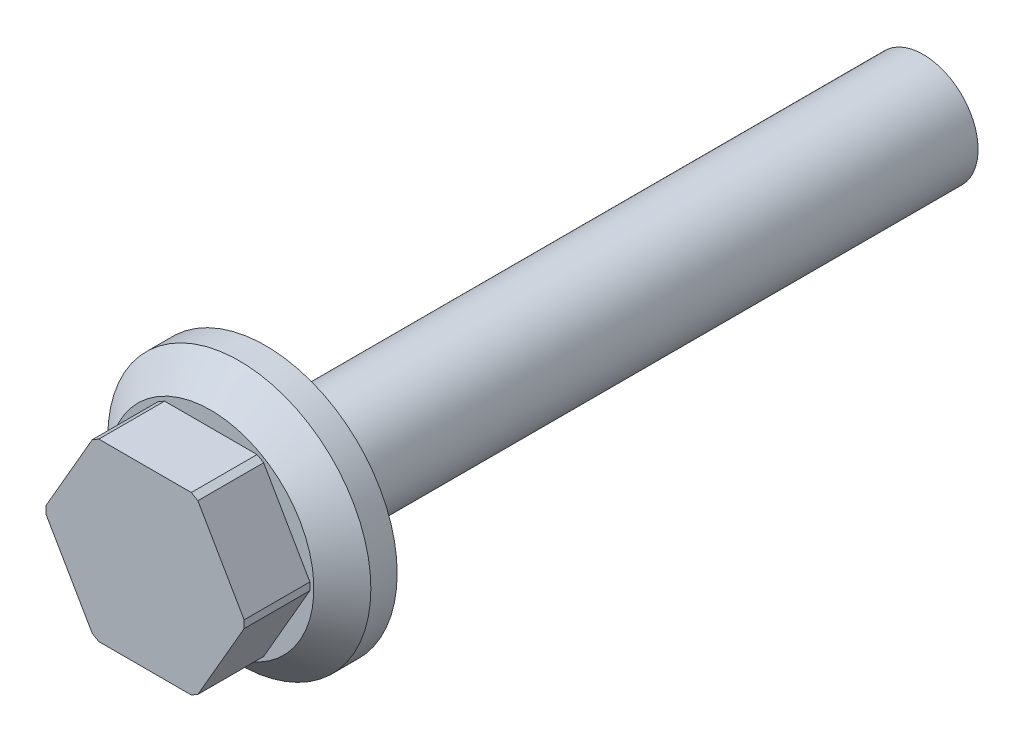
ISO-10303-21;
HEADER;
FILE_DESCRIPTION(('STEP AP214'),'2;1');
FILE_NAME('part.step','',(''),(''),'','','');
FILE_SCHEMA(('AUTOMOTIVE_DESIGN { 1 0 10303 214 1 1 1 1 }'));
ENDSEC;
DATA;
#1=APPLICATION_CONTEXT('core data for automotive mechanical design processes');
#2=APPLICATION_PROTOCOL_DEFINITION('international standard','automotive_design',2000,#1);
#3=PRODUCT_CONTEXT('',#1,'mechanical');
#4=PRODUCT('Part','Part','',(#3));
#5=PRODUCT_RELATED_PRODUCT_CATEGORY('part','',(#4));
#6=PRODUCT_DEFINITION_FORMATION('','',#4);
#7=PRODUCT_DEFINITION_CONTEXT('part definition',#1,'design');
#8=PRODUCT_DEFINITION('design','',#6,#7);
#9=PRODUCT_DEFINITION_SHAPE('','',#8);
#10=(LENGTH_UNIT() NAMED_UNIT(*) SI_UNIT(.MILLI.,.METRE.));
#11=(NAMED_UNIT(*) PLANE_ANGLE_UNIT() SI_UNIT($,.RADIAN.));
#12=(NAMED_UNIT(*) SI_UNIT($,.STERADIAN.) SOLID_ANGLE_UNIT());
#13=UNCERTAINTY_MEASURE_WITH_UNIT(LENGTH_MEASURE(1.E-05),#10,'distance_accuracy_value','');
#14=(GEOMETRIC_REPRESENTATION_CONTEXT(3) GLOBAL_UNCERTAINTY_ASSIGNED_CONTEXT((#13)) GLOBAL_UNIT_ASSIGNED_CONTEXT((#10,
#11,#12)) REPRESENTATION_CONTEXT('',''));
#15=CARTESIAN_POINT('',(0.,0.,0.));
#16=DIRECTION('',(0.,0.,1.));
#17=DIRECTION('',(1.,0.,0.));
#18=AXIS2_PLACEMENT_3D('',#15,#16,#17);
#19=CARTESIAN_POINT('',(0.,0.,-30.));
#20=DIRECTION('',(0.,0.,-1.));
#21=DIRECTION('',(-1.,0.,0.));
#22=AXIS2_PLACEMENT_3D('',#19,#20,#21);
#23=CYLINDRICAL_SURFACE('',#22,2.5);
#24=CARTESIAN_POINT('',(0.,0.,-30.));
#25=DIRECTION('',(0.,0.,-1.));
#26=DIRECTION('',(-1.,0.,0.));
#27=AXIS2_PLACEMENT_3D('',#24,#25,#26);
#28=CIRCLE('',#27,2.5);
#29=CARTESIAN_POINT('',(-2.5,0.,-30.));
#30=VERTEX_POINT('',#29);
#31=EDGE_CURVE('E233',#30,#30,#28,.T.);
#32=ORIENTED_EDGE('',*,*,#31,.F.);
#33=EDGE_LOOP('',(#32));
#34=FACE_BOUND('',#33,.T.);
#35=CARTESIAN_POINT('',(0.,0.,0.));
#36=DIRECTION('',(0.,0.,-1.));
#37=DIRECTION('',(-1.,0.,0.));
#38=AXIS2_PLACEMENT_3D('',#35,#36,#37);
#39=CIRCLE('',#38,2.5);
#40=CARTESIAN_POINT('',(-2.5,0.,0.));
#41=VERTEX_POINT('',#40);
#42=EDGE_CURVE('E232',#41,#41,#39,.T.);
#43=ORIENTED_EDGE('',*,*,#42,.T.);
#44=EDGE_LOOP('',(#43));
#45=FACE_BOUND('',#44,.T.);
#46=ADVANCED_FACE('F39',(#34,#45),#23,.T.);
#47=CARTESIAN_POINT('',(2.5,0.,-30.));
#48=DIRECTION('',(0.,0.,1.));
#49=DIRECTION('',(1.,0.,0.));
#50=AXIS2_PLACEMENT_3D('',#47,#48,#49);
#51=PLANE('',#50);
#52=ORIENTED_EDGE('',*,*,#31,.T.);
#53=EDGE_LOOP('',(#52));
#54=FACE_BOUND('',#53,.T.);
#55=ADVANCED_FACE('F280',(#54),#51,.F.);
#56=CARTESIAN_POINT('',(0.,0.,1.));
#57=DIRECTION('',(0.,0.,-1.));
#58=DIRECTION('',(-1.,0.,0.));
#59=AXIS2_PLACEMENT_3D('',#56,#57,#58);
#60=CYLINDRICAL_SURFACE('',#59,6.);
#61=CARTESIAN_POINT('',(0.,0.,1.20000000000002));
#62=DIRECTION('',(0.,0.,-1.));
#63=DIRECTION('',(-1.,0.,0.));
#64=AXIS2_PLACEMENT_3D('',#61,#62,#63);
#65=CIRCLE('',#64,6.);
#66=CARTESIAN_POINT('',(-6.,0.,1.20000000000002));
#67=VERTEX_POINT('',#66);
#68=EDGE_CURVE('E241',#67,#67,#65,.T.);
#69=ORIENTED_EDGE('',*,*,#68,.T.);
#70=EDGE_LOOP('',(#69));
#71=FACE_BOUND('',#70,.T.);
#72=CARTESIAN_POINT('',(0.,0.,0.));
#73=DIRECTION('',(0.,0.,1.));
#74=DIRECTION('',(1.,0.,0.));
#75=AXIS2_PLACEMENT_3D('',#72,#73,#74);
#76=CIRCLE('',#75,6.);
#77=CARTESIAN_POINT('',(6.,0.,0.));
#78=VERTEX_POINT('',#77);
#79=EDGE_CURVE('E229',#78,#78,#76,.T.);
#80=ORIENTED_EDGE('',*,*,#79,.T.);
#81=EDGE_LOOP('',(#80));
#82=FACE_BOUND('',#81,.T.);
#83=ADVANCED_FACE('F286',(#71,#82),#60,.T.);
#84=CARTESIAN_POINT('',(0.,0.,0.));
#85=DIRECTION('',(0.,0.,1.));
#86=DIRECTION('',(1.,0.,0.));
#87=AXIS2_PLACEMENT_3D('',#84,#85,#86);
#88=PLANE('',#87);
#89=ORIENTED_EDGE('',*,*,#42,.F.);
#90=EDGE_LOOP('',(#89));
#91=FACE_BOUND('',#90,.T.);
#92=ORIENTED_EDGE('',*,*,#79,.F.);
#93=EDGE_LOOP('',(#92));
#94=FACE_BOUND('',#93,.T.);
#95=ADVANCED_FACE('F340',(#91,#94),#88,.F.);
#96=CARTESIAN_POINT('',(0.,0.,2.5));
#97=DIRECTION('',(0.,0.,1.));
#98=DIRECTION('',(1.,0.,0.));
#99=AXIS2_PLACEMENT_3D('',#96,#97,#98);
#100=PLANE('',#99);
#101=DIRECTION('',(-1.,0.,0.));
#102=VECTOR('',#101,1.);
#103=CARTESIAN_POINT('',(0.,4.,2.5));
#104=LINE('',#103,#102);
#105=CARTESIAN_POINT('',(2.10940107675849,4.,2.5));
#106=VERTEX_POINT('',#105);
#107=CARTESIAN_POINT('',(-2.1094010767585,4.,2.5));
#108=VERTEX_POINT('',#107);
#109=EDGE_CURVE('E139',#106,#108,#104,.T.);
#110=ORIENTED_EDGE('',*,*,#109,.F.);
#111=DIRECTION('',(-0.866025403784443,0.499999999999993,0.));
#112=VECTOR('',#111,1.);
#113=CARTESIAN_POINT('',(2.40940107675851,3.82679491924311,2.5));
#114=LINE('',#113,#112);
#115=CARTESIAN_POINT('',(2.40940107675851,3.82679491924311,2.5));
#116=VERTEX_POINT('',#115);
#117=EDGE_CURVE('E165',#106,#116,#114,.F.);
#118=ORIENTED_EDGE('',*,*,#117,.T.);
#119=DIRECTION('',(-0.5,0.866025403784439,0.));
#120=VECTOR('',#119,1.);
#121=CARTESIAN_POINT('',(3.46410161513776,2.,2.5));
#122=LINE('',#121,#120);
#123=CARTESIAN_POINT('',(4.51880215351701,0.173205080756888,2.5));
#124=VERTEX_POINT('',#123);
#125=EDGE_CURVE('E175',#124,#116,#122,.T.);
#126=ORIENTED_EDGE('',*,*,#125,.F.);
#127=DIRECTION('',(0.,1.,0.));
#128=VECTOR('',#127,1.);
#129=CARTESIAN_POINT('',(4.51880215351701,-0.173205080756891,2.5));
#130=LINE('',#129,#128);
#131=CARTESIAN_POINT('',(4.51880215351701,-0.173205080756891,2.5));
#132=VERTEX_POINT('',#131);
#133=EDGE_CURVE('E48',#124,#132,#130,.F.);
#134=ORIENTED_EDGE('',*,*,#133,.T.);
#135=DIRECTION('',(0.5,0.866025403784439,0.));
#136=VECTOR('',#135,1.);
#137=CARTESIAN_POINT('',(3.46410161513776,-2.,2.5));
#138=LINE('',#137,#136);
#139=CARTESIAN_POINT('',(2.40940107675851,-3.82679491924311,2.5));
#140=VERTEX_POINT('',#139);
#141=EDGE_CURVE('E172',#140,#132,#138,.T.);
#142=ORIENTED_EDGE('',*,*,#141,.F.);
#143=DIRECTION('',(0.866025403784437,0.500000000000003,0.));
#144=VECTOR('',#143,1.);
#145=CARTESIAN_POINT('',(2.1094010767585,-4.,2.5));
#146=LINE('',#145,#144);
#147=CARTESIAN_POINT('',(2.1094010767585,-4.,2.5));
#148=VERTEX_POINT('',#147);
#149=EDGE_CURVE('E163',#140,#148,#146,.F.);
#150=ORIENTED_EDGE('',*,*,#149,.T.);
#151=DIRECTION('',(1.,0.,0.));
#152=VECTOR('',#151,1.);
#153=CARTESIAN_POINT('',(0.,-4.,2.5));
#154=LINE('',#153,#152);
#155=CARTESIAN_POINT('',(-2.10940107675851,-4.,2.5));
#156=VERTEX_POINT('',#155);
#157=EDGE_CURVE('E147',#156,#148,#154,.T.);
#158=ORIENTED_EDGE('',*,*,#157,.F.);
#159=DIRECTION('',(0.86602540378444,-0.499999999999997,0.));
#160=VECTOR('',#159,1.);
#161=CARTESIAN_POINT('',(-2.4094010767585,-3.82679491924312,2.5));
#162=LINE('',#161,#160);
#163=CARTESIAN_POINT('',(-2.4094010767585,-3.82679491924312,2.5));
#164=VERTEX_POINT('',#163);
#165=EDGE_CURVE('E146',#156,#164,#162,.F.);
#166=ORIENTED_EDGE('',*,*,#165,.T.);
#167=DIRECTION('',(0.5,-0.866025403784439,0.));
#168=VECTOR('',#167,1.);
#169=CARTESIAN_POINT('',(-3.46410161513776,-2.,2.5));
#170=LINE('',#169,#168);
#171=CARTESIAN_POINT('',(-4.51880215351701,-0.173205080756891,2.5));
#172=VERTEX_POINT('',#171);
#173=EDGE_CURVE('E133',#172,#164,#170,.T.);
#174=ORIENTED_EDGE('',*,*,#173,.F.);
#175=DIRECTION('',(0.,-1.,0.));
#176=VECTOR('',#175,1.);
#177=CARTESIAN_POINT('',(-4.51880215351701,0.173205080756895,2.5));
#178=LINE('',#177,#176);
#179=CARTESIAN_POINT('',(-4.51880215351701,0.173205080756895,2.5));
#180=VERTEX_POINT('',#179);
#181=EDGE_CURVE('E11',#172,#180,#178,.F.);
#182=ORIENTED_EDGE('',*,*,#181,.T.);
#183=DIRECTION('',(-0.5,-0.866025403784439,0.));
#184=VECTOR('',#183,1.);
#185=CARTESIAN_POINT('',(-3.46410161513776,2.,2.5));
#186=LINE('',#185,#184);
#187=CARTESIAN_POINT('',(-2.4094010767585,3.82679491924311,2.5));
#188=VERTEX_POINT('',#187);
#189=EDGE_CURVE('E148',#188,#180,#186,.T.);
#190=ORIENTED_EDGE('',*,*,#189,.F.);
#191=DIRECTION('',(-0.866025403784437,-0.500000000000003,0.));
#192=VECTOR('',#191,1.);
#193=CARTESIAN_POINT('',(-2.1094010767585,4.,2.5));
#194=LINE('',#193,#192);
#195=EDGE_CURVE('E167',#188,#108,#194,.F.);
#196=ORIENTED_EDGE('',*,*,#195,.T.);
#197=EDGE_LOOP('',(#110,#118,#126,#134,#142,#150,#158,#166,#174,#182,#190,#196));
#198=FACE_BOUND('',#197,.T.);
#199=CARTESIAN_POINT('',(0.,0.,2.5));
#200=DIRECTION('',(0.,0.,1.));
#201=DIRECTION('',(1.,0.,0.));
#202=AXIS2_PLACEMENT_3D('',#199,#200,#201);
#203=CIRCLE('',#202,4.70000000000003);
#204=CARTESIAN_POINT('',(-4.70000000000003,0.,2.5));
#205=VERTEX_POINT('',#204);
#206=EDGE_CURVE('E236',#205,#205,#203,.T.);
#207=ORIENTED_EDGE('',*,*,#206,.T.);
#208=EDGE_LOOP('',(#207));
#209=FACE_BOUND('',#208,.T.);
#210=ADVANCED_FACE('F142',(#198,#209),#100,.T.);
#211=CARTESIAN_POINT('',(0.,0.,2.80000000000003));
#212=DIRECTION('',(0.,0.,-1.));
#213=DIRECTION('',(-1.,0.,0.));
#214=AXIS2_PLACEMENT_3D('',#211,#212,#213);
#215=CONICAL_SURFACE('',#214,4.4,0.785398163397443);
#216=CARTESIAN_POINT('',(-6.,0.,1.20000000000002));
#217=CARTESIAN_POINT('',(-5.98645833333333,0.,1.21354166666668));
#218=CARTESIAN_POINT('',(-5.97291666666667,0.,1.22708333333335));
#219=CARTESIAN_POINT('',(-5.94583333333333,0.,1.25416666666668));
#220=CARTESIAN_POINT('',(-5.93229166666667,0.,1.26770833333335));
#221=CARTESIAN_POINT('',(-5.90520833333333,0.,1.29479166666668));
#222=CARTESIAN_POINT('',(-5.89166666666667,0.,1.30833333333335));
#223=CARTESIAN_POINT('',(-5.86458333333334,0.,1.33541666666668));
#224=CARTESIAN_POINT('',(-5.85104166666667,0.,1.34895833333335));
#225=CARTESIAN_POINT('',(-5.82395833333334,0.,1.37604166666668));
#226=CARTESIAN_POINT('',(-5.81041666666667,0.,1.38958333333335));
#227=CARTESIAN_POINT('',(-5.78333333333334,0.,1.41666666666668));
#228=CARTESIAN_POINT('',(-5.76979166666667,0.,1.43020833333335));
#229=CARTESIAN_POINT('',(-5.74270833333334,0.,1.45729166666668));
#230=CARTESIAN_POINT('',(-5.72916666666667,0.,1.47083333333335));
#231=CARTESIAN_POINT('',(-5.70208333333334,0.,1.49791666666668));
#232=CARTESIAN_POINT('',(-5.68854166666667,0.,1.51145833333335));
#233=CARTESIAN_POINT('',(-5.66145833333334,0.,1.53854166666668));
#234=CARTESIAN_POINT('',(-5.64791666666667,0.,1.55208333333335));
#235=CARTESIAN_POINT('',(-5.62083333333334,0.,1.57916666666668));
#236=CARTESIAN_POINT('',(-5.60729166666667,0.,1.59270833333334));
#237=CARTESIAN_POINT('',(-5.58020833333334,0.,1.61979166666668));
#238=CARTESIAN_POINT('',(-5.56666666666668,0.,1.63333333333334));
#239=CARTESIAN_POINT('',(-5.53958333333334,0.,1.66041666666668));
#240=CARTESIAN_POINT('',(-5.52604166666668,0.,1.67395833333334));
#241=CARTESIAN_POINT('',(-5.49895833333334,0.,1.70104166666668));
#242=CARTESIAN_POINT('',(-5.48541666666668,0.,1.71458333333334));
#243=CARTESIAN_POINT('',(-5.45833333333335,0.,1.74166666666668));
#244=CARTESIAN_POINT('',(-5.44479166666668,0.,1.75520833333334));
#245=CARTESIAN_POINT('',(-5.41770833333335,0.,1.78229166666668));
#246=CARTESIAN_POINT('',(-5.40416666666668,0.,1.79583333333334));
#247=CARTESIAN_POINT('',(-5.37708333333335,0.,1.82291666666668));
#248=CARTESIAN_POINT('',(-5.36354166666668,0.,1.83645833333334));
#249=CARTESIAN_POINT('',(-5.33645833333335,0.,1.86354166666667));
#250=CARTESIAN_POINT('',(-5.32291666666668,0.,1.87708333333334));
#251=CARTESIAN_POINT('',(-5.29583333333335,0.,1.90416666666667));
#252=CARTESIAN_POINT('',(-5.28229166666668,0.,1.91770833333334));
#253=CARTESIAN_POINT('',(-5.25520833333335,0.,1.94479166666667));
#254=CARTESIAN_POINT('',(-5.24166666666668,0.,1.95833333333334));
#255=CARTESIAN_POINT('',(-5.21458333333335,0.,1.98541666666667));
#256=CARTESIAN_POINT('',(-5.20104166666668,0.,1.99895833333334));
#257=CARTESIAN_POINT('',(-5.17395833333335,0.,2.02604166666667));
#258=CARTESIAN_POINT('',(-5.16041666666669,0.,2.03958333333334));
#259=CARTESIAN_POINT('',(-5.13333333333335,0.,2.06666666666667));
#260=CARTESIAN_POINT('',(-5.11979166666669,0.,2.08020833333334));
#261=CARTESIAN_POINT('',(-5.09270833333335,0.,2.10729166666667));
#262=CARTESIAN_POINT('',(-5.07916666666669,0.,2.12083333333334));
#263=CARTESIAN_POINT('',(-5.05208333333335,0.,2.14791666666667));
#264=CARTESIAN_POINT('',(-5.03854166666669,0.,2.16145833333334));
#265=CARTESIAN_POINT('',(-5.01145833333336,0.,2.18854166666667));
#266=CARTESIAN_POINT('',(-4.99791666666669,0.,2.20208333333334));
#267=CARTESIAN_POINT('',(-4.97083333333336,0.,2.22916666666667));
#268=CARTESIAN_POINT('',(-4.95729166666669,0.,2.24270833333334));
#269=CARTESIAN_POINT('',(-4.93020833333336,0.,2.26979166666667));
#270=CARTESIAN_POINT('',(-4.91666666666669,0.,2.28333333333334));
#271=CARTESIAN_POINT('',(-4.88958333333336,0.,2.31041666666667));
#272=CARTESIAN_POINT('',(-4.87604166666669,0.,2.32395833333334));
#273=CARTESIAN_POINT('',(-4.84895833333336,0.,2.35104166666667));
#274=CARTESIAN_POINT('',(-4.83541666666669,0.,2.36458333333333));
#275=CARTESIAN_POINT('',(-4.80833333333336,0.,2.39166666666667));
#276=CARTESIAN_POINT('',(-4.79479166666669,0.,2.40520833333333));
#277=CARTESIAN_POINT('',(-4.76770833333336,0.,2.43229166666667));
#278=CARTESIAN_POINT('',(-4.75416666666669,0.,2.44583333333333));
#279=CARTESIAN_POINT('',(-4.72708333333336,0.,2.47291666666667));
#280=CARTESIAN_POINT('',(-4.71354166666669,0.,2.48645833333333));
#281=CARTESIAN_POINT('',(-4.70000000000003,0.,2.5));
#282=B_SPLINE_CURVE_WITH_KNOTS('',3,(#216,#217,#218,#219,#220,#221,#222,#223,#224,#225,#226,
#227,#228,#229,#230,#231,#232,#233,#234,#235,#236,#237,#238,#239,#240,#241,#242,#243,#244,#245,
#246,#247,#248,#249,#250,#251,#252,#253,#254,#255,#256,#257,#258,#259,#260,#261,#262,#263,#264,
#265,#266,#267,#268,#269,#270,#271,#272,#273,#274,#275,#276,#277,#278,#279,#280,#281),
.UNSPECIFIED.,.F.,.F.,(4,2,2,2,2,2,2,2,2,2,2,2,2,2,2,2,2,2,2,2,2,2,2,2,2,2,2,2,2,2,2,2,4),(0.,
0.0574524259714059,0.114904851942812,0.172357277914218,0.229809703885624,0.28726212985703,
0.344714555828436,0.402166981799841,0.459619407771247,0.517071833742653,0.574524259714059,
0.631976685685465,0.689429111656871,0.746881537628277,0.804333963599683,0.861786389571089,
0.919238815542495,0.976691241513901,1.03414366748531,1.09159609345671,1.14904851942812,
1.20650094539952,1.26395337137093,1.32140579734234,1.37885822331374,1.43631064928515,
1.49376307525655,1.55121550122796,1.60866792719937,1.66612035317077,1.72357277914218,
1.78102520511358,1.83847763108499),.UNSPECIFIED.);
#283=EDGE_CURVE('BSEAM294',#67,#205,#282,.T.);
#284=ORIENTED_EDGE('',*,*,#68,.F.);
#285=ORIENTED_EDGE('',*,*,#206,.F.);
#286=ORIENTED_EDGE('',*,*,#283,.T.);
#287=ORIENTED_EDGE('',*,*,#283,.F.);
#288=EDGE_LOOP('',(#284,#286,#285,#287));
#289=FACE_BOUND('',#288,.T.);
#290=ADVANCED_FACE('F294',(#289),#215,.T.);
#291=CARTESIAN_POINT('',(2.30940107675851,4.,1.));
#292=DIRECTION('',(0.,1.,0.));
#293=DIRECTION('',(0.,0.,1.));
#294=AXIS2_PLACEMENT_3D('',#291,#292,#293);
#295=PLANE('',#294);
#296=DIRECTION('',(-1.,0.,0.));
#297=VECTOR('',#296,1.);
#298=CARTESIAN_POINT('',(2.30940107675851,4.,5.5));
#299=LINE('',#298,#297);
#300=CARTESIAN_POINT('',(2.10940107675849,4.,5.5));
#301=VERTEX_POINT('',#300);
#302=CARTESIAN_POINT('',(-2.1094010767585,4.,5.5));
#303=VERTEX_POINT('',#302);
#304=EDGE_CURVE('E208',#301,#303,#299,.T.);
#305=ORIENTED_EDGE('',*,*,#304,.F.);
#306=DIRECTION('',(0.,0.,-1.));
#307=VECTOR('',#306,1.);
#308=CARTESIAN_POINT('',(2.10940107675849,4.,1.));
#309=LINE('',#308,#307);
#310=EDGE_CURVE('E155',#301,#106,#309,.T.);
#311=ORIENTED_EDGE('',*,*,#310,.T.);
#312=ORIENTED_EDGE('',*,*,#109,.T.);
#313=DIRECTION('',(0.,0.,1.));
#314=VECTOR('',#313,1.);
#315=CARTESIAN_POINT('',(-2.1094010767585,4.,1.));
#316=LINE('',#315,#314);
#317=EDGE_CURVE('E158',#108,#303,#316,.T.);
#318=ORIENTED_EDGE('',*,*,#317,.T.);
#319=EDGE_LOOP('',(#305,#311,#312,#318));
#320=FACE_BOUND('',#319,.T.);
#321=ADVANCED_FACE('F207',(#320),#295,.T.);
#322=CARTESIAN_POINT('',(4.61880215351701,0.,1.));
#323=DIRECTION('',(0.866025403784439,0.5,0.));
#324=DIRECTION('',(-0.5,0.866025403784439,0.));
#325=AXIS2_PLACEMENT_3D('',#322,#323,#324);
#326=PLANE('',#325);
#327=ORIENTED_EDGE('',*,*,#125,.T.);
#328=DIRECTION('',(0.,0.,1.));
#329=VECTOR('',#328,1.);
#330=CARTESIAN_POINT('',(2.40940107675851,3.82679491924311,1.));
#331=LINE('',#330,#329);
#332=CARTESIAN_POINT('',(2.40940107675851,3.82679491924311,5.5));
#333=VERTEX_POINT('',#332);
#334=EDGE_CURVE('E199',#116,#333,#331,.T.);
#335=ORIENTED_EDGE('',*,*,#334,.T.);
#336=DIRECTION('',(-0.5,0.866025403784439,0.));
#337=VECTOR('',#336,1.);
#338=CARTESIAN_POINT('',(4.61880215351701,0.,5.5));
#339=LINE('',#338,#337);
#340=CARTESIAN_POINT('',(4.51880215351701,0.173205080756889,5.5));
#341=VERTEX_POINT('',#340);
#342=EDGE_CURVE('E227',#341,#333,#339,.T.);
#343=ORIENTED_EDGE('',*,*,#342,.F.);
#344=DIRECTION('',(0.,0.,-1.));
#345=VECTOR('',#344,1.);
#346=CARTESIAN_POINT('',(4.51880215351701,0.173205080756889,1.));
#347=LINE('',#346,#345);
#348=EDGE_CURVE('E192',#341,#124,#347,.T.);
#349=ORIENTED_EDGE('',*,*,#348,.T.);
#350=EDGE_LOOP('',(#327,#335,#343,#349));
#351=FACE_BOUND('',#350,.T.);
#352=ADVANCED_FACE('F337',(#351),#326,.T.);
#353=CARTESIAN_POINT('',(2.3094010767585,-4.,1.));
#354=DIRECTION('',(0.866025403784439,-0.5,0.));
#355=DIRECTION('',(0.5,0.866025403784439,0.));
#356=AXIS2_PLACEMENT_3D('',#353,#354,#355);
#357=PLANE('',#356);
#358=DIRECTION('',(0.5,0.866025403784438,0.));
#359=VECTOR('',#358,1.);
#360=CARTESIAN_POINT('',(2.3094010767585,-4.,5.5));
#361=LINE('',#360,#359);
#362=CARTESIAN_POINT('',(2.40940107675851,-3.82679491924311,5.5));
#363=VERTEX_POINT('',#362);
#364=CARTESIAN_POINT('',(4.51880215351701,-0.173205080756892,5.5));
#365=VERTEX_POINT('',#364);
#366=EDGE_CURVE('E225',#363,#365,#361,.T.);
#367=ORIENTED_EDGE('',*,*,#366,.F.);
#368=DIRECTION('',(0.,0.,-1.));
#369=VECTOR('',#368,1.);
#370=CARTESIAN_POINT('',(2.40940107675851,-3.82679491924311,1.));
#371=LINE('',#370,#369);
#372=EDGE_CURVE('E186',#363,#140,#371,.T.);
#373=ORIENTED_EDGE('',*,*,#372,.T.);
#374=ORIENTED_EDGE('',*,*,#141,.T.);
#375=DIRECTION('',(0.,0.,1.));
#376=VECTOR('',#375,1.);
#377=CARTESIAN_POINT('',(4.51880215351701,-0.173205080756892,1.));
#378=LINE('',#377,#376);
#379=EDGE_CURVE('E183',#132,#365,#378,.T.);
#380=ORIENTED_EDGE('',*,*,#379,.T.);
#381=EDGE_LOOP('',(#367,#373,#374,#380));
#382=FACE_BOUND('',#381,.T.);
#383=ADVANCED_FACE('F182',(#382),#357,.T.);
#384=CARTESIAN_POINT('',(-2.3094010767585,-4.,1.));
#385=DIRECTION('',(0.,-1.,0.));
#386=DIRECTION('',(0.,0.,-1.));
#387=AXIS2_PLACEMENT_3D('',#384,#385,#386);
#388=PLANE('',#387);
#389=DIRECTION('',(1.,0.,0.));
#390=VECTOR('',#389,1.);
#391=CARTESIAN_POINT('',(-2.3094010767585,-4.,5.5));
#392=LINE('',#391,#390);
#393=CARTESIAN_POINT('',(-2.10940107675851,-4.,5.5));
#394=VERTEX_POINT('',#393);
#395=CARTESIAN_POINT('',(2.1094010767585,-4.,5.5));
#396=VERTEX_POINT('',#395);
#397=EDGE_CURVE('E222',#394,#396,#392,.T.);
#398=ORIENTED_EDGE('',*,*,#397,.F.);
#399=DIRECTION('',(0.,0.,-1.));
#400=VECTOR('',#399,1.);
#401=CARTESIAN_POINT('',(-2.10940107675851,-4.,1.));
#402=LINE('',#401,#400);
#403=EDGE_CURVE('E190',#394,#156,#402,.T.);
#404=ORIENTED_EDGE('',*,*,#403,.T.);
#405=ORIENTED_EDGE('',*,*,#157,.T.);
#406=DIRECTION('',(0.,0.,1.));
#407=VECTOR('',#406,1.);
#408=CARTESIAN_POINT('',(2.1094010767585,-4.,1.));
#409=LINE('',#408,#407);
#410=EDGE_CURVE('E194',#148,#396,#409,.T.);
#411=ORIENTED_EDGE('',*,*,#410,.T.);
#412=EDGE_LOOP('',(#398,#404,#405,#411));
#413=FACE_BOUND('',#412,.T.);
#414=ADVANCED_FACE('F261',(#413),#388,.T.);
#415=CARTESIAN_POINT('',(-4.61880215351701,0.,1.));
#416=DIRECTION('',(-0.866025403784439,-0.5,0.));
#417=DIRECTION('',(0.5,-0.866025403784439,0.));
#418=AXIS2_PLACEMENT_3D('',#415,#416,#417);
#419=PLANE('',#418);
#420=ORIENTED_EDGE('',*,*,#173,.T.);
#421=DIRECTION('',(0.,0.,1.));
#422=VECTOR('',#421,1.);
#423=CARTESIAN_POINT('',(-2.4094010767585,-3.82679491924312,1.));
#424=LINE('',#423,#422);
#425=CARTESIAN_POINT('',(-2.4094010767585,-3.82679491924312,5.5));
#426=VERTEX_POINT('',#425);
#427=EDGE_CURVE('E138',#164,#426,#424,.T.);
#428=ORIENTED_EDGE('',*,*,#427,.T.);
#429=DIRECTION('',(0.5,-0.866025403784439,0.));
#430=VECTOR('',#429,1.);
#431=CARTESIAN_POINT('',(-4.61880215351701,0.,5.5));
#432=LINE('',#431,#430);
#433=CARTESIAN_POINT('',(-4.51880215351701,-0.173205080756891,5.5));
#434=VERTEX_POINT('',#433);
#435=EDGE_CURVE('E136',#434,#426,#432,.T.);
#436=ORIENTED_EDGE('',*,*,#435,.F.);
#437=DIRECTION('',(0.,0.,-1.));
#438=VECTOR('',#437,1.);
#439=CARTESIAN_POINT('',(-4.51880215351701,-0.173205080756891,1.));
#440=LINE('',#439,#438);
#441=EDGE_CURVE('E130',#434,#172,#440,.T.);
#442=ORIENTED_EDGE('',*,*,#441,.T.);
#443=EDGE_LOOP('',(#420,#428,#436,#442));
#444=FACE_BOUND('',#443,.T.);
#445=ADVANCED_FACE('F131',(#444),#419,.T.);
#446=CARTESIAN_POINT('',(-2.3094010767585,4.,1.));
#447=DIRECTION('',(-0.866025403784438,0.5,0.));
#448=DIRECTION('',(-0.5,-0.866025403784439,0.));
#449=AXIS2_PLACEMENT_3D('',#446,#447,#448);
#450=PLANE('',#449);
#451=DIRECTION('',(-0.5,-0.866025403784439,0.));
#452=VECTOR('',#451,1.);
#453=CARTESIAN_POINT('',(-2.3094010767585,4.,5.5));
#454=LINE('',#453,#452);
#455=CARTESIAN_POINT('',(-2.4094010767585,3.82679491924311,5.5));
#456=VERTEX_POINT('',#455);
#457=CARTESIAN_POINT('',(-4.51880215351701,0.173205080756895,5.5));
#458=VERTEX_POINT('',#457);
#459=EDGE_CURVE('E217',#456,#458,#454,.T.);
#460=ORIENTED_EDGE('',*,*,#459,.F.);
#461=DIRECTION('',(0.,0.,-1.));
#462=VECTOR('',#461,1.);
#463=CARTESIAN_POINT('',(-2.4094010767585,3.82679491924311,1.));
#464=LINE('',#463,#462);
#465=EDGE_CURVE('E60',#456,#188,#464,.T.);
#466=ORIENTED_EDGE('',*,*,#465,.T.);
#467=ORIENTED_EDGE('',*,*,#189,.T.);
#468=DIRECTION('',(0.,0.,1.));
#469=VECTOR('',#468,1.);
#470=CARTESIAN_POINT('',(-4.51880215351701,0.173205080756895,1.));
#471=LINE('',#470,#469);
#472=EDGE_CURVE('E152',#180,#458,#471,.T.);
#473=ORIENTED_EDGE('',*,*,#472,.T.);
#474=EDGE_LOOP('',(#460,#466,#467,#473));
#475=FACE_BOUND('',#474,.T.);
#476=ADVANCED_FACE('F324',(#475),#450,.T.);
#477=CARTESIAN_POINT('',(0.,0.,5.5));
#478=DIRECTION('',(0.,0.,1.));
#479=DIRECTION('',(1.,0.,0.));
#480=AXIS2_PLACEMENT_3D('',#477,#478,#479);
#481=PLANE('',#480);
#482=ORIENTED_EDGE('',*,*,#435,.T.);
#483=DIRECTION('',(-0.86602540378444,0.499999999999997,0.));
#484=VECTOR('',#483,1.);
#485=CARTESIAN_POINT('',(-2.25940107675849,-3.91339745962157,5.5));
#486=LINE('',#485,#484);
#487=EDGE_CURVE('E256',#426,#394,#486,.F.);
#488=ORIENTED_EDGE('',*,*,#487,.T.);
#489=ORIENTED_EDGE('',*,*,#397,.T.);
#490=DIRECTION('',(-0.866025403784437,-0.500000000000003,0.));
#491=VECTOR('',#490,1.);
#492=CARTESIAN_POINT('',(2.25940107675852,-3.91339745962155,5.5));
#493=LINE('',#492,#491);
#494=EDGE_CURVE('E254',#396,#363,#493,.F.);
#495=ORIENTED_EDGE('',*,*,#494,.T.);
#496=ORIENTED_EDGE('',*,*,#366,.T.);
#497=DIRECTION('',(0.,-1.,0.));
#498=VECTOR('',#497,1.);
#499=CARTESIAN_POINT('',(4.51880215351701,0.,5.5));
#500=LINE('',#499,#498);
#501=EDGE_CURVE('E189',#365,#341,#500,.F.);
#502=ORIENTED_EDGE('',*,*,#501,.T.);
#503=ORIENTED_EDGE('',*,*,#342,.T.);
#504=DIRECTION('',(0.866025403784443,-0.499999999999993,0.));
#505=VECTOR('',#504,1.);
#506=CARTESIAN_POINT('',(2.25940107675847,3.91339745962157,5.5));
#507=LINE('',#506,#505);
#508=EDGE_CURVE('E216',#333,#301,#507,.F.);
#509=ORIENTED_EDGE('',*,*,#508,.T.);
#510=ORIENTED_EDGE('',*,*,#304,.T.);
#511=DIRECTION('',(0.866025403784437,0.500000000000003,0.));
#512=VECTOR('',#511,1.);
#513=CARTESIAN_POINT('',(-2.25940107675852,3.91339745962155,5.5));
#514=LINE('',#513,#512);
#515=EDGE_CURVE('E214',#303,#456,#514,.F.);
#516=ORIENTED_EDGE('',*,*,#515,.T.);
#517=ORIENTED_EDGE('',*,*,#459,.T.);
#518=DIRECTION('',(0.,1.,0.));
#519=VECTOR('',#518,1.);
#520=CARTESIAN_POINT('',(-4.51880215351701,0.,5.5));
#521=LINE('',#520,#519);
#522=EDGE_CURVE('E153',#458,#434,#521,.F.);
#523=ORIENTED_EDGE('',*,*,#522,.T.);
#524=EDGE_LOOP('',(#482,#488,#489,#495,#496,#502,#503,#509,#510,#516,#517,#523));
#525=FACE_BOUND('',#524,.T.);
#526=ADVANCED_FACE('F213',(#525),#481,.T.);
#527=CARTESIAN_POINT('',(-2.4094010767585,-3.82679491924312,1.));
#528=DIRECTION('',(0.499999999999997,0.86602540378444,0.));
#529=DIRECTION('',(0.,0.,1.));
#530=AXIS2_PLACEMENT_3D('',#527,#528,#529);
#531=PLANE('',#530);
#532=ORIENTED_EDGE('',*,*,#165,.F.);
#533=ORIENTED_EDGE('',*,*,#403,.F.);
#534=ORIENTED_EDGE('',*,*,#487,.F.);
#535=ORIENTED_EDGE('',*,*,#427,.F.);
#536=EDGE_LOOP('',(#532,#533,#534,#535));
#537=FACE_BOUND('',#536,.T.);
#538=ADVANCED_FACE('F265',(#537),#531,.F.);
#539=CARTESIAN_POINT('',(2.1094010767585,-4.,1.));
#540=DIRECTION('',(-0.500000000000003,0.866025403784437,0.));
#541=DIRECTION('',(0.,0.,1.));
#542=AXIS2_PLACEMENT_3D('',#539,#540,#541);
#543=PLANE('',#542);
#544=ORIENTED_EDGE('',*,*,#149,.F.);
#545=ORIENTED_EDGE('',*,*,#372,.F.);
#546=ORIENTED_EDGE('',*,*,#494,.F.);
#547=ORIENTED_EDGE('',*,*,#410,.F.);
#548=EDGE_LOOP('',(#544,#545,#546,#547));
#549=FACE_BOUND('',#548,.T.);
#550=ADVANCED_FACE('F266',(#549),#543,.F.);
#551=CARTESIAN_POINT('',(2.40940107675851,3.82679491924311,1.));
#552=DIRECTION('',(-0.499999999999993,-0.866025403784443,0.));
#553=DIRECTION('',(0.,0.,1.));
#554=AXIS2_PLACEMENT_3D('',#551,#552,#553);
#555=PLANE('',#554);
#556=ORIENTED_EDGE('',*,*,#117,.F.);
#557=ORIENTED_EDGE('',*,*,#310,.F.);
#558=ORIENTED_EDGE('',*,*,#508,.F.);
#559=ORIENTED_EDGE('',*,*,#334,.F.);
#560=EDGE_LOOP('',(#556,#557,#558,#559));
#561=FACE_BOUND('',#560,.T.);
#562=ADVANCED_FACE('F268',(#561),#555,.F.);
#563=CARTESIAN_POINT('',(-2.1094010767585,4.,1.));
#564=DIRECTION('',(0.500000000000003,-0.866025403784437,0.));
#565=DIRECTION('',(0.,0.,1.));
#566=AXIS2_PLACEMENT_3D('',#563,#564,#565);
#567=PLANE('',#566);
#568=ORIENTED_EDGE('',*,*,#195,.F.);
#569=ORIENTED_EDGE('',*,*,#465,.F.);
#570=ORIENTED_EDGE('',*,*,#515,.F.);
#571=ORIENTED_EDGE('',*,*,#317,.F.);
#572=EDGE_LOOP('',(#568,#569,#570,#571));
#573=FACE_BOUND('',#572,.T.);
#574=ADVANCED_FACE('F274',(#573),#567,.F.);
#575=CARTESIAN_POINT('',(4.51880215351701,-0.173205080756891,1.));
#576=DIRECTION('',(-1.,0.,0.));
#577=DIRECTION('',(0.,0.,1.));
#578=AXIS2_PLACEMENT_3D('',#575,#576,#577);
#579=PLANE('',#578);
#580=ORIENTED_EDGE('',*,*,#133,.F.);
#581=ORIENTED_EDGE('',*,*,#348,.F.);
#582=ORIENTED_EDGE('',*,*,#501,.F.);
#583=ORIENTED_EDGE('',*,*,#379,.F.);
#584=EDGE_LOOP('',(#580,#581,#582,#583));
#585=FACE_BOUND('',#584,.T.);
#586=ADVANCED_FACE('F188',(#585),#579,.F.);
#587=CARTESIAN_POINT('',(-4.51880215351701,0.173205080756895,1.));
#588=DIRECTION('',(1.,0.,0.));
#589=DIRECTION('',(0.,0.,1.));
#590=AXIS2_PLACEMENT_3D('',#587,#588,#589);
#591=PLANE('',#590);
#592=ORIENTED_EDGE('',*,*,#181,.F.);
#593=ORIENTED_EDGE('',*,*,#441,.F.);
#594=ORIENTED_EDGE('',*,*,#522,.F.);
#595=ORIENTED_EDGE('',*,*,#472,.F.);
#596=EDGE_LOOP('',(#592,#593,#594,#595));
#597=FACE_BOUND('',#596,.T.);
#598=ADVANCED_FACE('F42',(#597),#591,.F.);
#599=CLOSED_SHELL('',(#46,#55,#83,#95,#210,#290,#321,#352,#383,#414,#445,#476,#526,#538,#550,
#562,#574,#586,#598));
#600=MANIFOLD_SOLID_BREP('B2',#599);
#601=ADVANCED_BREP_SHAPE_REPRESENTATION('',(#18,#600),#14);
#602=SHAPE_DEFINITION_REPRESENTATION(#9,#601);
ENDSEC;
END-ISO-10303-21;
